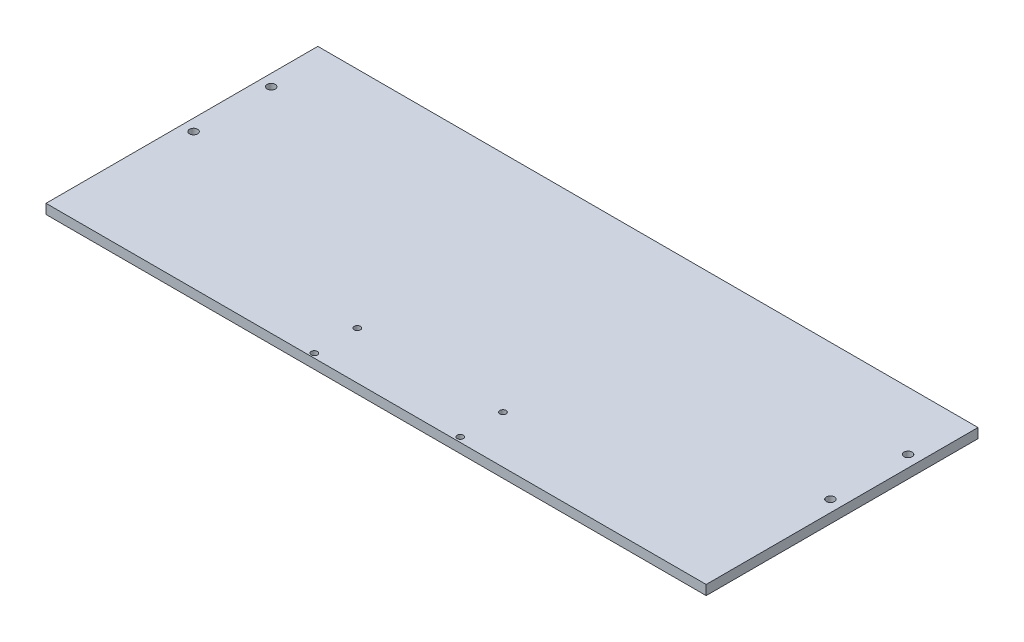
ISO-10303-21;
HEADER;
FILE_DESCRIPTION(('STEP AP214'),'2;1');
FILE_NAME('part.step','',(''),(''),'','','');
FILE_SCHEMA(('AUTOMOTIVE_DESIGN { 1 0 10303 214 1 1 1 1 }'));
ENDSEC;
DATA;
#1=APPLICATION_CONTEXT('core data for automotive mechanical design processes');
#2=APPLICATION_PROTOCOL_DEFINITION('international standard','automotive_design',2000,#1);
#3=PRODUCT_CONTEXT('',#1,'mechanical');
#4=PRODUCT('Part','Part','',(#3));
#5=PRODUCT_RELATED_PRODUCT_CATEGORY('part','',(#4));
#6=PRODUCT_DEFINITION_FORMATION('','',#4);
#7=PRODUCT_DEFINITION_CONTEXT('part definition',#1,'design');
#8=PRODUCT_DEFINITION('design','',#6,#7);
#9=PRODUCT_DEFINITION_SHAPE('','',#8);
#10=(LENGTH_UNIT() NAMED_UNIT(*) SI_UNIT(.MILLI.,.METRE.));
#11=(NAMED_UNIT(*) PLANE_ANGLE_UNIT() SI_UNIT($,.RADIAN.));
#12=(NAMED_UNIT(*) SI_UNIT($,.STERADIAN.) SOLID_ANGLE_UNIT());
#13=UNCERTAINTY_MEASURE_WITH_UNIT(LENGTH_MEASURE(1.E-05),#10,'distance_accuracy_value','');
#14=(GEOMETRIC_REPRESENTATION_CONTEXT(3) GLOBAL_UNCERTAINTY_ASSIGNED_CONTEXT((#13)) GLOBAL_UNIT_ASSIGNED_CONTEXT((#10,
#11,#12)) REPRESENTATION_CONTEXT('',''));
#15=CARTESIAN_POINT('',(0.,0.,0.));
#16=DIRECTION('',(0.,0.,1.));
#17=DIRECTION('',(1.,0.,0.));
#18=AXIS2_PLACEMENT_3D('',#15,#16,#17);
#19=CARTESIAN_POINT('',(0.,5.,0.));
#20=DIRECTION('',(0.,-1.,0.));
#21=DIRECTION('',(0.,0.,-1.));
#22=AXIS2_PLACEMENT_3D('',#19,#20,#21);
#23=PLANE('',#22);
#24=DIRECTION('',(0.,0.,-1.));
#25=VECTOR('',#24,1.);
#26=CARTESIAN_POINT('',(170.,5.,70.));
#27=LINE('',#26,#25);
#28=CARTESIAN_POINT('',(170.,5.,70.));
#29=VERTEX_POINT('',#28);
#30=CARTESIAN_POINT('',(170.,5.,-70.));
#31=VERTEX_POINT('',#30);
#32=EDGE_CURVE('E91',#29,#31,#27,.T.);
#33=ORIENTED_EDGE('',*,*,#32,.T.);
#34=DIRECTION('',(-1.,0.,0.));
#35=VECTOR('',#34,1.);
#36=CARTESIAN_POINT('',(-170.,5.,-70.));
#37=LINE('',#36,#35);
#38=CARTESIAN_POINT('',(-170.,5.,-70.));
#39=VERTEX_POINT('',#38);
#40=EDGE_CURVE('E86',#31,#39,#37,.T.);
#41=ORIENTED_EDGE('',*,*,#40,.T.);
#42=DIRECTION('',(0.,0.,1.));
#43=VECTOR('',#42,1.);
#44=CARTESIAN_POINT('',(-170.,5.,70.));
#45=LINE('',#44,#43);
#46=CARTESIAN_POINT('',(-170.,5.,70.));
#47=VERTEX_POINT('',#46);
#48=EDGE_CURVE('E89',#39,#47,#45,.T.);
#49=ORIENTED_EDGE('',*,*,#48,.T.);
#50=DIRECTION('',(1.,0.,0.));
#51=VECTOR('',#50,1.);
#52=CARTESIAN_POINT('',(-170.,5.,70.));
#53=LINE('',#52,#51);
#54=EDGE_CURVE('E56',#47,#29,#53,.T.);
#55=ORIENTED_EDGE('',*,*,#54,.T.);
#56=EDGE_LOOP('',(#33,#41,#49,#55));
#57=FACE_BOUND('',#56,.T.);
#58=CARTESIAN_POINT('',(164.000000000003,5.,-40.0000000000019));
#59=DIRECTION('',(0.,1.,0.));
#60=DIRECTION('',(0.,0.,1.));
#61=AXIS2_PLACEMENT_3D('',#58,#59,#60);
#62=CIRCLE('',#61,2.09999999999999);
#63=CARTESIAN_POINT('',(164.000000000003,5.,-37.9000000000019));
#64=VERTEX_POINT('',#63);
#65=EDGE_CURVE('E106',#64,#64,#62,.T.);
#66=ORIENTED_EDGE('',*,*,#65,.F.);
#67=EDGE_LOOP('',(#66));
#68=FACE_BOUND('',#67,.T.);
#69=CARTESIAN_POINT('',(164.000000000003,5.,-1.92554305833426E-12));
#70=DIRECTION('',(0.,1.,0.));
#71=DIRECTION('',(0.,0.,1.));
#72=AXIS2_PLACEMENT_3D('',#69,#70,#71);
#73=CIRCLE('',#72,2.09999999999999);
#74=CARTESIAN_POINT('',(164.000000000003,5.,2.09999999999806));
#75=VERTEX_POINT('',#74);
#76=EDGE_CURVE('E121',#75,#75,#73,.T.);
#77=ORIENTED_EDGE('',*,*,#76,.F.);
#78=EDGE_LOOP('',(#77));
#79=FACE_BOUND('',#78,.T.);
#80=CARTESIAN_POINT('',(-164.000000000006,5.,-40.0000000000026));
#81=DIRECTION('',(0.,1.,0.));
#82=DIRECTION('',(0.,0.,1.));
#83=AXIS2_PLACEMENT_3D('',#80,#81,#82);
#84=CIRCLE('',#83,2.09999999999999);
#85=CARTESIAN_POINT('',(-164.000000000006,5.,-37.9000000000026));
#86=VERTEX_POINT('',#85);
#87=EDGE_CURVE('E127',#86,#86,#84,.T.);
#88=ORIENTED_EDGE('',*,*,#87,.F.);
#89=EDGE_LOOP('',(#88));
#90=FACE_BOUND('',#89,.T.);
#91=CARTESIAN_POINT('',(-164.000000000006,5.,-2.56739074444567E-12));
#92=DIRECTION('',(0.,1.,0.));
#93=DIRECTION('',(0.,0.,1.));
#94=AXIS2_PLACEMENT_3D('',#91,#92,#93);
#95=CIRCLE('',#94,2.09999999999999);
#96=CARTESIAN_POINT('',(-164.000000000006,5.,2.09999999999742));
#97=VERTEX_POINT('',#96);
#98=EDGE_CURVE('E133',#97,#97,#95,.T.);
#99=ORIENTED_EDGE('',*,*,#98,.F.);
#100=EDGE_LOOP('',(#99));
#101=FACE_BOUND('',#100,.T.);
#102=CARTESIAN_POINT('',(-34.1556990016445,5.,45.4999999999982));
#103=DIRECTION('',(0.,1.,0.));
#104=DIRECTION('',(0.,0.,1.));
#105=AXIS2_PLACEMENT_3D('',#102,#103,#104);
#106=CIRCLE('',#105,1.6);
#107=CARTESIAN_POINT('',(-34.1556990016445,5.,47.0999999999982));
#108=VERTEX_POINT('',#107);
#109=EDGE_CURVE('E139',#108,#108,#106,.T.);
#110=ORIENTED_EDGE('',*,*,#109,.F.);
#111=EDGE_LOOP('',(#110));
#112=FACE_BOUND('',#111,.T.);
#113=CARTESIAN_POINT('',(-34.0556990016446,5.,67.748331477353));
#114=DIRECTION('',(0.,1.,0.));
#115=DIRECTION('',(0.,0.,1.));
#116=AXIS2_PLACEMENT_3D('',#113,#114,#115);
#117=CIRCLE('',#116,1.6);
#118=CARTESIAN_POINT('',(-34.0556990016446,5.,69.348331477353));
#119=VERTEX_POINT('',#118);
#120=EDGE_CURVE('E145',#119,#119,#117,.T.);
#121=ORIENTED_EDGE('',*,*,#120,.F.);
#122=EDGE_LOOP('',(#121));
#123=FACE_BOUND('',#122,.T.);
#124=CARTESIAN_POINT('',(40.8443009983554,5.,67.4999999999984));
#125=DIRECTION('',(0.,1.,0.));
#126=DIRECTION('',(0.,0.,1.));
#127=AXIS2_PLACEMENT_3D('',#124,#125,#126);
#128=CIRCLE('',#127,1.6);
#129=CARTESIAN_POINT('',(40.8443009983554,5.,69.0999999999984));
#130=VERTEX_POINT('',#129);
#131=EDGE_CURVE('E151',#130,#130,#128,.T.);
#132=ORIENTED_EDGE('',*,*,#131,.F.);
#133=EDGE_LOOP('',(#132));
#134=FACE_BOUND('',#133,.T.);
#135=CARTESIAN_POINT('',(40.8443009983555,5.,45.4999999999984));
#136=DIRECTION('',(0.,1.,0.));
#137=DIRECTION('',(0.,0.,1.));
#138=AXIS2_PLACEMENT_3D('',#135,#136,#137);
#139=CIRCLE('',#138,1.6);
#140=CARTESIAN_POINT('',(40.8443009983555,5.,47.0999999999984));
#141=VERTEX_POINT('',#140);
#142=EDGE_CURVE('E157',#141,#141,#139,.T.);
#143=ORIENTED_EDGE('',*,*,#142,.F.);
#144=EDGE_LOOP('',(#143));
#145=FACE_BOUND('',#144,.T.);
#146=ADVANCED_FACE('F39',(#57,#68,#79,#90,#101,#112,#123,#134,#145),#23,.F.);
#147=CARTESIAN_POINT('',(0.,0.,0.));
#148=DIRECTION('',(0.,-1.,0.));
#149=DIRECTION('',(0.,0.,-1.));
#150=AXIS2_PLACEMENT_3D('',#147,#148,#149);
#151=PLANE('',#150);
#152=CARTESIAN_POINT('',(40.8443009983554,0.,67.4999999999984));
#153=DIRECTION('',(0.,1.,0.));
#154=DIRECTION('',(0.,0.,1.));
#155=AXIS2_PLACEMENT_3D('',#152,#153,#154);
#156=CIRCLE('',#155,1.6);
#157=CARTESIAN_POINT('',(40.8443009983554,0.,69.0999999999984));
#158=VERTEX_POINT('',#157);
#159=EDGE_CURVE('E154',#158,#158,#156,.T.);
#160=ORIENTED_EDGE('',*,*,#159,.T.);
#161=EDGE_LOOP('',(#160));
#162=FACE_BOUND('',#161,.T.);
#163=CARTESIAN_POINT('',(-34.1556990016445,0.,45.4999999999982));
#164=DIRECTION('',(0.,1.,0.));
#165=DIRECTION('',(0.,0.,1.));
#166=AXIS2_PLACEMENT_3D('',#163,#164,#165);
#167=CIRCLE('',#166,1.6);
#168=CARTESIAN_POINT('',(-34.1556990016445,0.,47.0999999999982));
#169=VERTEX_POINT('',#168);
#170=EDGE_CURVE('E142',#169,#169,#167,.T.);
#171=ORIENTED_EDGE('',*,*,#170,.T.);
#172=EDGE_LOOP('',(#171));
#173=FACE_BOUND('',#172,.T.);
#174=CARTESIAN_POINT('',(-164.000000000006,0.,-40.0000000000026));
#175=DIRECTION('',(0.,1.,0.));
#176=DIRECTION('',(0.,0.,1.));
#177=AXIS2_PLACEMENT_3D('',#174,#175,#176);
#178=CIRCLE('',#177,2.09999999999999);
#179=CARTESIAN_POINT('',(-164.000000000006,0.,-37.9000000000026));
#180=VERTEX_POINT('',#179);
#181=EDGE_CURVE('E130',#180,#180,#178,.T.);
#182=ORIENTED_EDGE('',*,*,#181,.T.);
#183=EDGE_LOOP('',(#182));
#184=FACE_BOUND('',#183,.T.);
#185=CARTESIAN_POINT('',(164.000000000003,0.,-40.0000000000019));
#186=DIRECTION('',(0.,1.,0.));
#187=DIRECTION('',(0.,0.,1.));
#188=AXIS2_PLACEMENT_3D('',#185,#186,#187);
#189=CIRCLE('',#188,2.09999999999999);
#190=CARTESIAN_POINT('',(164.000000000003,0.,-37.9000000000019));
#191=VERTEX_POINT('',#190);
#192=EDGE_CURVE('E118',#191,#191,#189,.T.);
#193=ORIENTED_EDGE('',*,*,#192,.T.);
#194=EDGE_LOOP('',(#193));
#195=FACE_BOUND('',#194,.T.);
#196=DIRECTION('',(0.,0.,-1.));
#197=VECTOR('',#196,1.);
#198=CARTESIAN_POINT('',(170.,0.,70.));
#199=LINE('',#198,#197);
#200=CARTESIAN_POINT('',(170.,0.,70.));
#201=VERTEX_POINT('',#200);
#202=CARTESIAN_POINT('',(170.,0.,-70.));
#203=VERTEX_POINT('',#202);
#204=EDGE_CURVE('E103',#201,#203,#199,.T.);
#205=ORIENTED_EDGE('',*,*,#204,.F.);
#206=DIRECTION('',(1.,0.,0.));
#207=VECTOR('',#206,1.);
#208=CARTESIAN_POINT('',(-170.,0.,70.));
#209=LINE('',#208,#207);
#210=CARTESIAN_POINT('',(-170.,0.,70.));
#211=VERTEX_POINT('',#210);
#212=EDGE_CURVE('E79',#211,#201,#209,.T.);
#213=ORIENTED_EDGE('',*,*,#212,.F.);
#214=DIRECTION('',(0.,0.,1.));
#215=VECTOR('',#214,1.);
#216=CARTESIAN_POINT('',(-170.,0.,70.));
#217=LINE('',#216,#215);
#218=CARTESIAN_POINT('',(-170.,0.,-70.));
#219=VERTEX_POINT('',#218);
#220=EDGE_CURVE('E73',#219,#211,#217,.T.);
#221=ORIENTED_EDGE('',*,*,#220,.F.);
#222=DIRECTION('',(-1.,0.,0.));
#223=VECTOR('',#222,1.);
#224=CARTESIAN_POINT('',(-170.,0.,-70.));
#225=LINE('',#224,#223);
#226=EDGE_CURVE('E95',#203,#219,#225,.T.);
#227=ORIENTED_EDGE('',*,*,#226,.F.);
#228=EDGE_LOOP('',(#205,#213,#221,#227));
#229=FACE_BOUND('',#228,.T.);
#230=CARTESIAN_POINT('',(164.000000000003,0.,-1.92554305833426E-12));
#231=DIRECTION('',(0.,1.,0.));
#232=DIRECTION('',(0.,0.,1.));
#233=AXIS2_PLACEMENT_3D('',#230,#231,#232);
#234=CIRCLE('',#233,2.09999999999999);
#235=CARTESIAN_POINT('',(164.000000000003,0.,2.09999999999806));
#236=VERTEX_POINT('',#235);
#237=EDGE_CURVE('E124',#236,#236,#234,.T.);
#238=ORIENTED_EDGE('',*,*,#237,.T.);
#239=EDGE_LOOP('',(#238));
#240=FACE_BOUND('',#239,.T.);
#241=CARTESIAN_POINT('',(-164.000000000006,0.,-2.56739074444567E-12));
#242=DIRECTION('',(0.,1.,0.));
#243=DIRECTION('',(0.,0.,1.));
#244=AXIS2_PLACEMENT_3D('',#241,#242,#243);
#245=CIRCLE('',#244,2.09999999999999);
#246=CARTESIAN_POINT('',(-164.000000000006,0.,2.09999999999742));
#247=VERTEX_POINT('',#246);
#248=EDGE_CURVE('E136',#247,#247,#245,.T.);
#249=ORIENTED_EDGE('',*,*,#248,.T.);
#250=EDGE_LOOP('',(#249));
#251=FACE_BOUND('',#250,.T.);
#252=CARTESIAN_POINT('',(-34.0556990016446,0.,67.748331477353));
#253=DIRECTION('',(0.,1.,0.));
#254=DIRECTION('',(0.,0.,1.));
#255=AXIS2_PLACEMENT_3D('',#252,#253,#254);
#256=CIRCLE('',#255,1.6);
#257=CARTESIAN_POINT('',(-34.0556990016446,0.,69.348331477353));
#258=VERTEX_POINT('',#257);
#259=EDGE_CURVE('E148',#258,#258,#256,.T.);
#260=ORIENTED_EDGE('',*,*,#259,.T.);
#261=EDGE_LOOP('',(#260));
#262=FACE_BOUND('',#261,.T.);
#263=CARTESIAN_POINT('',(40.8443009983555,0.,45.4999999999984));
#264=DIRECTION('',(0.,1.,0.));
#265=DIRECTION('',(0.,0.,1.));
#266=AXIS2_PLACEMENT_3D('',#263,#264,#265);
#267=CIRCLE('',#266,1.6);
#268=CARTESIAN_POINT('',(40.8443009983555,0.,47.0999999999984));
#269=VERTEX_POINT('',#268);
#270=EDGE_CURVE('E160',#269,#269,#267,.T.);
#271=ORIENTED_EDGE('',*,*,#270,.T.);
#272=EDGE_LOOP('',(#271));
#273=FACE_BOUND('',#272,.T.);
#274=ADVANCED_FACE('F114',(#162,#173,#184,#195,#229,#240,#251,#262,#273),#151,.T.);
#275=CARTESIAN_POINT('',(170.,5.,70.));
#276=DIRECTION('',(-1.,0.,0.));
#277=DIRECTION('',(0.,0.,1.));
#278=AXIS2_PLACEMENT_3D('',#275,#276,#277);
#279=PLANE('',#278);
#280=ORIENTED_EDGE('',*,*,#204,.T.);
#281=DIRECTION('',(0.,-1.,0.));
#282=VECTOR('',#281,1.);
#283=CARTESIAN_POINT('',(170.,5.,-70.));
#284=LINE('',#283,#282);
#285=EDGE_CURVE('E11',#31,#203,#284,.T.);
#286=ORIENTED_EDGE('',*,*,#285,.F.);
#287=ORIENTED_EDGE('',*,*,#32,.F.);
#288=DIRECTION('',(0.,-1.,0.));
#289=VECTOR('',#288,1.);
#290=CARTESIAN_POINT('',(170.,5.,70.));
#291=LINE('',#290,#289);
#292=EDGE_CURVE('E99',#29,#201,#291,.T.);
#293=ORIENTED_EDGE('',*,*,#292,.T.);
#294=EDGE_LOOP('',(#280,#286,#287,#293));
#295=FACE_BOUND('',#294,.T.);
#296=ADVANCED_FACE('F41',(#295),#279,.F.);
#297=CARTESIAN_POINT('',(-170.,5.,-70.));
#298=DIRECTION('',(0.,0.,1.));
#299=DIRECTION('',(1.,0.,0.));
#300=AXIS2_PLACEMENT_3D('',#297,#298,#299);
#301=PLANE('',#300);
#302=ORIENTED_EDGE('',*,*,#226,.T.);
#303=DIRECTION('',(0.,-1.,0.));
#304=VECTOR('',#303,1.);
#305=CARTESIAN_POINT('',(-170.,5.,-70.));
#306=LINE('',#305,#304);
#307=EDGE_CURVE('E48',#39,#219,#306,.T.);
#308=ORIENTED_EDGE('',*,*,#307,.F.);
#309=ORIENTED_EDGE('',*,*,#40,.F.);
#310=ORIENTED_EDGE('',*,*,#285,.T.);
#311=EDGE_LOOP('',(#302,#308,#309,#310));
#312=FACE_BOUND('',#311,.T.);
#313=ADVANCED_FACE('F94',(#312),#301,.F.);
#314=CARTESIAN_POINT('',(-170.,5.,70.));
#315=DIRECTION('',(1.,0.,0.));
#316=DIRECTION('',(0.,0.,-1.));
#317=AXIS2_PLACEMENT_3D('',#314,#315,#316);
#318=PLANE('',#317);
#319=ORIENTED_EDGE('',*,*,#220,.T.);
#320=DIRECTION('',(0.,-1.,0.));
#321=VECTOR('',#320,1.);
#322=CARTESIAN_POINT('',(-170.,5.,70.));
#323=LINE('',#322,#321);
#324=EDGE_CURVE('E96',#47,#211,#323,.T.);
#325=ORIENTED_EDGE('',*,*,#324,.F.);
#326=ORIENTED_EDGE('',*,*,#48,.F.);
#327=ORIENTED_EDGE('',*,*,#307,.T.);
#328=EDGE_LOOP('',(#319,#325,#326,#327));
#329=FACE_BOUND('',#328,.T.);
#330=ADVANCED_FACE('F97',(#329),#318,.F.);
#331=CARTESIAN_POINT('',(-170.,5.,70.));
#332=DIRECTION('',(0.,0.,-1.));
#333=DIRECTION('',(-1.,0.,0.));
#334=AXIS2_PLACEMENT_3D('',#331,#332,#333);
#335=PLANE('',#334);
#336=ORIENTED_EDGE('',*,*,#212,.T.);
#337=ORIENTED_EDGE('',*,*,#292,.F.);
#338=ORIENTED_EDGE('',*,*,#54,.F.);
#339=ORIENTED_EDGE('',*,*,#324,.T.);
#340=EDGE_LOOP('',(#336,#337,#338,#339));
#341=FACE_BOUND('',#340,.T.);
#342=ADVANCED_FACE('F111',(#341),#335,.F.);
#343=CARTESIAN_POINT('',(164.000000000003,5.,-40.0000000000019));
#344=DIRECTION('',(0.,-1.,0.));
#345=DIRECTION('',(0.,0.,-1.));
#346=AXIS2_PLACEMENT_3D('',#343,#344,#345);
#347=CYLINDRICAL_SURFACE('',#346,2.09999999999999);
#348=ORIENTED_EDGE('',*,*,#65,.T.);
#349=EDGE_LOOP('',(#348));
#350=FACE_BOUND('',#349,.T.);
#351=ORIENTED_EDGE('',*,*,#192,.F.);
#352=EDGE_LOOP('',(#351));
#353=FACE_BOUND('',#352,.T.);
#354=ADVANCED_FACE('F177',(#350,#353),#347,.F.);
#355=CARTESIAN_POINT('',(164.000000000003,5.,-1.92554305833426E-12));
#356=DIRECTION('',(0.,-1.,0.));
#357=DIRECTION('',(0.,0.,-1.));
#358=AXIS2_PLACEMENT_3D('',#355,#356,#357);
#359=CYLINDRICAL_SURFACE('',#358,2.09999999999999);
#360=ORIENTED_EDGE('',*,*,#76,.T.);
#361=EDGE_LOOP('',(#360));
#362=FACE_BOUND('',#361,.T.);
#363=ORIENTED_EDGE('',*,*,#237,.F.);
#364=EDGE_LOOP('',(#363));
#365=FACE_BOUND('',#364,.T.);
#366=ADVANCED_FACE('F222',(#362,#365),#359,.F.);
#367=CARTESIAN_POINT('',(-164.000000000006,5.,-40.0000000000026));
#368=DIRECTION('',(0.,-1.,0.));
#369=DIRECTION('',(0.,0.,-1.));
#370=AXIS2_PLACEMENT_3D('',#367,#368,#369);
#371=CYLINDRICAL_SURFACE('',#370,2.09999999999999);
#372=ORIENTED_EDGE('',*,*,#87,.T.);
#373=EDGE_LOOP('',(#372));
#374=FACE_BOUND('',#373,.T.);
#375=ORIENTED_EDGE('',*,*,#181,.F.);
#376=EDGE_LOOP('',(#375));
#377=FACE_BOUND('',#376,.T.);
#378=ADVANCED_FACE('F230',(#374,#377),#371,.F.);
#379=CARTESIAN_POINT('',(-164.000000000006,5.,-2.56739074444567E-12));
#380=DIRECTION('',(0.,-1.,0.));
#381=DIRECTION('',(0.,0.,-1.));
#382=AXIS2_PLACEMENT_3D('',#379,#380,#381);
#383=CYLINDRICAL_SURFACE('',#382,2.09999999999999);
#384=ORIENTED_EDGE('',*,*,#98,.T.);
#385=EDGE_LOOP('',(#384));
#386=FACE_BOUND('',#385,.T.);
#387=ORIENTED_EDGE('',*,*,#248,.F.);
#388=EDGE_LOOP('',(#387));
#389=FACE_BOUND('',#388,.T.);
#390=ADVANCED_FACE('F238',(#386,#389),#383,.F.);
#391=CARTESIAN_POINT('',(-34.1556990016445,5.,45.4999999999982));
#392=DIRECTION('',(0.,-1.,0.));
#393=DIRECTION('',(0.,0.,-1.));
#394=AXIS2_PLACEMENT_3D('',#391,#392,#393);
#395=CYLINDRICAL_SURFACE('',#394,1.6);
#396=ORIENTED_EDGE('',*,*,#109,.T.);
#397=EDGE_LOOP('',(#396));
#398=FACE_BOUND('',#397,.T.);
#399=ORIENTED_EDGE('',*,*,#170,.F.);
#400=EDGE_LOOP('',(#399));
#401=FACE_BOUND('',#400,.T.);
#402=ADVANCED_FACE('F247',(#398,#401),#395,.F.);
#403=CARTESIAN_POINT('',(-34.0556990016446,5.,67.748331477353));
#404=DIRECTION('',(0.,-1.,0.));
#405=DIRECTION('',(0.,0.,-1.));
#406=AXIS2_PLACEMENT_3D('',#403,#404,#405);
#407=CYLINDRICAL_SURFACE('',#406,1.6);
#408=ORIENTED_EDGE('',*,*,#120,.T.);
#409=EDGE_LOOP('',(#408));
#410=FACE_BOUND('',#409,.T.);
#411=ORIENTED_EDGE('',*,*,#259,.F.);
#412=EDGE_LOOP('',(#411));
#413=FACE_BOUND('',#412,.T.);
#414=ADVANCED_FACE('F256',(#410,#413),#407,.F.);
#415=CARTESIAN_POINT('',(40.8443009983554,5.,67.4999999999984));
#416=DIRECTION('',(0.,-1.,0.));
#417=DIRECTION('',(0.,0.,-1.));
#418=AXIS2_PLACEMENT_3D('',#415,#416,#417);
#419=CYLINDRICAL_SURFACE('',#418,1.6);
#420=ORIENTED_EDGE('',*,*,#131,.T.);
#421=EDGE_LOOP('',(#420));
#422=FACE_BOUND('',#421,.T.);
#423=ORIENTED_EDGE('',*,*,#159,.F.);
#424=EDGE_LOOP('',(#423));
#425=FACE_BOUND('',#424,.T.);
#426=ADVANCED_FACE('F265',(#422,#425),#419,.F.);
#427=CARTESIAN_POINT('',(40.8443009983555,5.,45.4999999999984));
#428=DIRECTION('',(0.,-1.,0.));
#429=DIRECTION('',(0.,0.,-1.));
#430=AXIS2_PLACEMENT_3D('',#427,#428,#429);
#431=CYLINDRICAL_SURFACE('',#430,1.6);
#432=ORIENTED_EDGE('',*,*,#142,.T.);
#433=EDGE_LOOP('',(#432));
#434=FACE_BOUND('',#433,.T.);
#435=ORIENTED_EDGE('',*,*,#270,.F.);
#436=EDGE_LOOP('',(#435));
#437=FACE_BOUND('',#436,.T.);
#438=ADVANCED_FACE('F166',(#434,#437),#431,.F.);
#439=CLOSED_SHELL('',(#146,#274,#296,#313,#330,#342,#354,#366,#378,#390,#402,#414,#426,#438));
#440=MANIFOLD_SOLID_BREP('B2',#439);
#441=ADVANCED_BREP_SHAPE_REPRESENTATION('',(#18,#440),#14);
#442=SHAPE_DEFINITION_REPRESENTATION(#9,#441);
ENDSEC;
END-ISO-10303-21;
